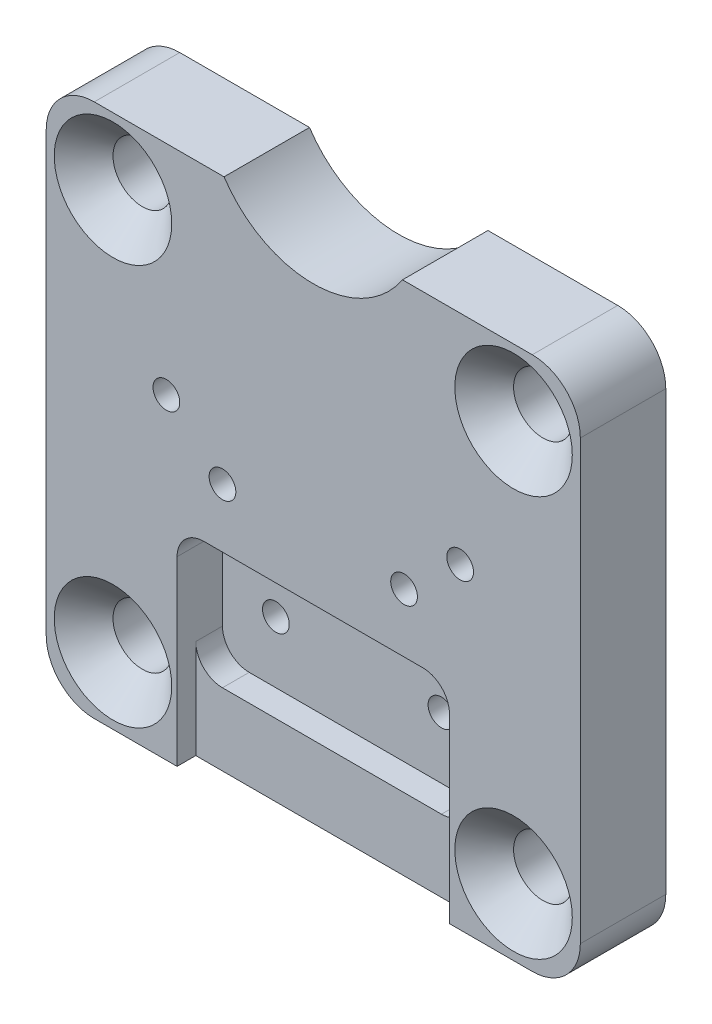
ISO-10303-21;
HEADER;
FILE_DESCRIPTION(('STEP AP214'),'2;1');
FILE_NAME('part.step','',(''),(''),'','','');
FILE_SCHEMA(('AUTOMOTIVE_DESIGN { 1 0 10303 214 1 1 1 1 }'));
ENDSEC;
DATA;
#1=APPLICATION_CONTEXT('core data for automotive mechanical design processes');
#2=APPLICATION_PROTOCOL_DEFINITION('international standard','automotive_design',2000,#1);
#3=PRODUCT_CONTEXT('',#1,'mechanical');
#4=PRODUCT('Part','Part','',(#3));
#5=PRODUCT_RELATED_PRODUCT_CATEGORY('part','',(#4));
#6=PRODUCT_DEFINITION_FORMATION('','',#4);
#7=PRODUCT_DEFINITION_CONTEXT('part definition',#1,'design');
#8=PRODUCT_DEFINITION('design','',#6,#7);
#9=PRODUCT_DEFINITION_SHAPE('','',#8);
#10=(LENGTH_UNIT() NAMED_UNIT(*) SI_UNIT(.MILLI.,.METRE.));
#11=(NAMED_UNIT(*) PLANE_ANGLE_UNIT() SI_UNIT($,.RADIAN.));
#12=(NAMED_UNIT(*) SI_UNIT($,.STERADIAN.) SOLID_ANGLE_UNIT());
#13=UNCERTAINTY_MEASURE_WITH_UNIT(LENGTH_MEASURE(1.E-05),#10,'distance_accuracy_value','');
#14=(GEOMETRIC_REPRESENTATION_CONTEXT(3) GLOBAL_UNCERTAINTY_ASSIGNED_CONTEXT((#13)) GLOBAL_UNIT_ASSIGNED_CONTEXT((#10,
#11,#12)) REPRESENTATION_CONTEXT('',''));
#15=CARTESIAN_POINT('',(0.,0.,0.));
#16=DIRECTION('',(0.,0.,1.));
#17=DIRECTION('',(1.,0.,0.));
#18=AXIS2_PLACEMENT_3D('',#15,#16,#17);
#19=CARTESIAN_POINT('',(10.,10.,3.2));
#20=DIRECTION('',(0.,-1.,0.));
#21=DIRECTION('',(0.,0.,-1.));
#22=AXIS2_PLACEMENT_3D('',#19,#20,#21);
#23=PLANE('',#22);
#24=DIRECTION('',(-1.,0.,0.));
#25=VECTOR('',#24,1.);
#26=CARTESIAN_POINT('',(10.,10.,0.));
#27=LINE('',#26,#25);
#28=CARTESIAN_POINT('',(8.20000000000001,10.,0.));
#29=VERTEX_POINT('',#28);
#30=CARTESIAN_POINT('',(3.34065861769801,10.,0.));
#31=VERTEX_POINT('',#30);
#32=EDGE_CURVE('E192',#29,#31,#27,.T.);
#33=ORIENTED_EDGE('',*,*,#32,.T.);
#34=DIRECTION('',(0.,0.,1.));
#35=VECTOR('',#34,1.);
#36=CARTESIAN_POINT('',(3.34065861769801,10.,0.));
#37=LINE('',#36,#35);
#38=CARTESIAN_POINT('',(3.34065861769801,10.,3.2));
#39=VERTEX_POINT('',#38);
#40=EDGE_CURVE('E51',#31,#39,#37,.T.);
#41=ORIENTED_EDGE('',*,*,#40,.T.);
#42=DIRECTION('',(-1.,0.,0.));
#43=VECTOR('',#42,1.);
#44=CARTESIAN_POINT('',(10.,10.,3.2));
#45=LINE('',#44,#43);
#46=CARTESIAN_POINT('',(8.20000000000001,10.,3.2));
#47=VERTEX_POINT('',#46);
#48=EDGE_CURVE('E205',#47,#39,#45,.T.);
#49=ORIENTED_EDGE('',*,*,#48,.F.);
#50=DIRECTION('',(0.,0.,-1.));
#51=VECTOR('',#50,1.);
#52=CARTESIAN_POINT('',(8.20000000000001,10.,3.2));
#53=LINE('',#52,#51);
#54=EDGE_CURVE('E233',#47,#29,#53,.T.);
#55=ORIENTED_EDGE('',*,*,#54,.T.);
#56=EDGE_LOOP('',(#33,#41,#49,#55));
#57=FACE_BOUND('',#56,.T.);
#58=ADVANCED_FACE('F36',(#57),#23,.F.);
#59=CARTESIAN_POINT('',(-3.1,-5.,3.2));
#60=DIRECTION('',(0.,0.,1.));
#61=DIRECTION('',(1.,0.,0.));
#62=AXIS2_PLACEMENT_3D('',#59,#60,#61);
#63=CYLINDRICAL_SURFACE('',#62,0.499999999999999);
#64=CARTESIAN_POINT('',(-3.1,-5.,0.));
#65=DIRECTION('',(0.,0.,1.));
#66=DIRECTION('',(1.,0.,0.));
#67=AXIS2_PLACEMENT_3D('',#64,#65,#66);
#68=CIRCLE('',#67,0.499999999999999);
#69=CARTESIAN_POINT('',(-2.6,-5.,0.));
#70=VERTEX_POINT('',#69);
#71=EDGE_CURVE('E358',#70,#70,#68,.T.);
#72=ORIENTED_EDGE('',*,*,#71,.F.);
#73=EDGE_LOOP('',(#72));
#74=FACE_BOUND('',#73,.T.);
#75=CARTESIAN_POINT('',(-3.1,-5.,1.5));
#76=DIRECTION('',(0.,0.,1.));
#77=DIRECTION('',(1.,0.,0.));
#78=AXIS2_PLACEMENT_3D('',#75,#76,#77);
#79=CIRCLE('',#78,0.499999999999999);
#80=CARTESIAN_POINT('',(-2.6,-5.,1.5));
#81=VERTEX_POINT('',#80);
#82=EDGE_CURVE('E242',#81,#81,#79,.F.);
#83=ORIENTED_EDGE('',*,*,#82,.F.);
#84=EDGE_LOOP('',(#83));
#85=FACE_BOUND('',#84,.T.);
#86=ADVANCED_FACE('F471',(#74,#85),#63,.F.);
#87=CARTESIAN_POINT('',(3.1,-5.,3.2));
#88=DIRECTION('',(0.,0.,1.));
#89=DIRECTION('',(1.,0.,0.));
#90=AXIS2_PLACEMENT_3D('',#87,#88,#89);
#91=CYLINDRICAL_SURFACE('',#90,0.499999999999999);
#92=CARTESIAN_POINT('',(3.1,-5.,0.));
#93=DIRECTION('',(0.,0.,1.));
#94=DIRECTION('',(1.,0.,0.));
#95=AXIS2_PLACEMENT_3D('',#92,#93,#94);
#96=CIRCLE('',#95,0.499999999999999);
#97=CARTESIAN_POINT('',(3.6,-5.,0.));
#98=VERTEX_POINT('',#97);
#99=EDGE_CURVE('E329',#98,#98,#96,.T.);
#100=ORIENTED_EDGE('',*,*,#99,.F.);
#101=EDGE_LOOP('',(#100));
#102=FACE_BOUND('',#101,.T.);
#103=CARTESIAN_POINT('',(3.1,-5.,1.5));
#104=DIRECTION('',(0.,0.,1.));
#105=DIRECTION('',(1.,0.,0.));
#106=AXIS2_PLACEMENT_3D('',#103,#104,#105);
#107=CIRCLE('',#106,0.499999999999999);
#108=CARTESIAN_POINT('',(3.6,-5.,1.5));
#109=VERTEX_POINT('',#108);
#110=EDGE_CURVE('E239',#109,#109,#107,.F.);
#111=ORIENTED_EDGE('',*,*,#110,.F.);
#112=EDGE_LOOP('',(#111));
#113=FACE_BOUND('',#112,.T.);
#114=ADVANCED_FACE('F476',(#102,#113),#91,.F.);
#115=CARTESIAN_POINT('',(-9.99999999999999,-10.,3.2));
#116=DIRECTION('',(1.,0.,0.));
#117=DIRECTION('',(0.,0.,-1.));
#118=AXIS2_PLACEMENT_3D('',#115,#116,#117);
#119=PLANE('',#118);
#120=DIRECTION('',(0.,-1.,0.));
#121=VECTOR('',#120,1.);
#122=CARTESIAN_POINT('',(-9.99999999999999,-10.,0.));
#123=LINE('',#122,#121);
#124=CARTESIAN_POINT('',(-9.99999999999999,8.2,0.));
#125=VERTEX_POINT('',#124);
#126=CARTESIAN_POINT('',(-9.99999999999999,-8.2,0.));
#127=VERTEX_POINT('',#126);
#128=EDGE_CURVE('E361',#125,#127,#123,.T.);
#129=ORIENTED_EDGE('',*,*,#128,.T.);
#130=DIRECTION('',(0.,0.,-1.));
#131=VECTOR('',#130,1.);
#132=CARTESIAN_POINT('',(-9.99999999999999,-8.2,3.2));
#133=LINE('',#132,#131);
#134=CARTESIAN_POINT('',(-9.99999999999999,-8.2,3.2));
#135=VERTEX_POINT('',#134);
#136=EDGE_CURVE('E218',#127,#135,#133,.F.);
#137=ORIENTED_EDGE('',*,*,#136,.T.);
#138=DIRECTION('',(0.,-1.,0.));
#139=VECTOR('',#138,1.);
#140=CARTESIAN_POINT('',(-9.99999999999999,-10.,3.2));
#141=LINE('',#140,#139);
#142=CARTESIAN_POINT('',(-9.99999999999999,8.2,3.2));
#143=VERTEX_POINT('',#142);
#144=EDGE_CURVE('E195',#143,#135,#141,.T.);
#145=ORIENTED_EDGE('',*,*,#144,.F.);
#146=DIRECTION('',(0.,0.,-1.));
#147=VECTOR('',#146,1.);
#148=CARTESIAN_POINT('',(-9.99999999999999,8.2,3.2));
#149=LINE('',#148,#147);
#150=EDGE_CURVE('E215',#143,#125,#149,.T.);
#151=ORIENTED_EDGE('',*,*,#150,.T.);
#152=EDGE_LOOP('',(#129,#137,#145,#151));
#153=FACE_BOUND('',#152,.T.);
#154=ADVANCED_FACE('F456',(#153),#119,.F.);
#155=CARTESIAN_POINT('',(10.,-9.99999999999999,3.2));
#156=DIRECTION('',(0.,1.,0.));
#157=DIRECTION('',(-1.,0.,0.));
#158=AXIS2_PLACEMENT_3D('',#155,#156,#157);
#159=PLANE('',#158);
#160=DIRECTION('',(1.,0.,0.));
#161=VECTOR('',#160,1.);
#162=CARTESIAN_POINT('',(-5.1,-10.,2.5));
#163=LINE('',#162,#161);
#164=CARTESIAN_POINT('',(-5.1,-10.,2.5));
#165=VERTEX_POINT('',#164);
#166=CARTESIAN_POINT('',(5.1,-10.,2.5));
#167=VERTEX_POINT('',#166);
#168=EDGE_CURVE('E320',#165,#167,#163,.T.);
#169=ORIENTED_EDGE('',*,*,#168,.F.);
#170=DIRECTION('',(0.,0.,1.));
#171=VECTOR('',#170,1.);
#172=CARTESIAN_POINT('',(-5.1,-10.,2.5));
#173=LINE('',#172,#171);
#174=CARTESIAN_POINT('',(-5.1,-10.,3.2));
#175=VERTEX_POINT('',#174);
#176=EDGE_CURVE('E325',#165,#175,#173,.T.);
#177=ORIENTED_EDGE('',*,*,#176,.T.);
#178=DIRECTION('',(1.,0.,0.));
#179=VECTOR('',#178,1.);
#180=CARTESIAN_POINT('',(10.,-9.99999999999999,3.2));
#181=LINE('',#180,#179);
#182=CARTESIAN_POINT('',(-8.2,-10.,3.2));
#183=VERTEX_POINT('',#182);
#184=EDGE_CURVE('E365',#183,#175,#181,.T.);
#185=ORIENTED_EDGE('',*,*,#184,.F.);
#186=DIRECTION('',(0.,0.,-1.));
#187=VECTOR('',#186,1.);
#188=CARTESIAN_POINT('',(-8.2,-10.,3.2));
#189=LINE('',#188,#187);
#190=CARTESIAN_POINT('',(-8.2,-10.,0.));
#191=VERTEX_POINT('',#190);
#192=EDGE_CURVE('E204',#183,#191,#189,.T.);
#193=ORIENTED_EDGE('',*,*,#192,.T.);
#194=DIRECTION('',(1.,0.,0.));
#195=VECTOR('',#194,1.);
#196=CARTESIAN_POINT('',(10.,-9.99999999999999,0.));
#197=LINE('',#196,#195);
#198=CARTESIAN_POINT('',(8.20000000000001,-9.99999999999999,0.));
#199=VERTEX_POINT('',#198);
#200=EDGE_CURVE('E197',#191,#199,#197,.T.);
#201=ORIENTED_EDGE('',*,*,#200,.T.);
#202=DIRECTION('',(0.,0.,-1.));
#203=VECTOR('',#202,1.);
#204=CARTESIAN_POINT('',(8.20000000000001,-9.99999999999999,3.2));
#205=LINE('',#204,#203);
#206=CARTESIAN_POINT('',(8.20000000000001,-9.99999999999999,3.2));
#207=VERTEX_POINT('',#206);
#208=EDGE_CURVE('E201',#199,#207,#205,.F.);
#209=ORIENTED_EDGE('',*,*,#208,.T.);
#210=CARTESIAN_POINT('',(5.1,-10.,3.2));
#211=VERTEX_POINT('',#210);
#212=EDGE_CURVE('E364',#211,#207,#181,.T.);
#213=ORIENTED_EDGE('',*,*,#212,.F.);
#214=DIRECTION('',(0.,0.,1.));
#215=VECTOR('',#214,1.);
#216=CARTESIAN_POINT('',(5.1,-10.,2.5));
#217=LINE('',#216,#215);
#218=EDGE_CURVE('E290',#167,#211,#217,.T.);
#219=ORIENTED_EDGE('',*,*,#218,.F.);
#220=EDGE_LOOP('',(#169,#177,#185,#193,#201,#209,#213,#219));
#221=FACE_BOUND('',#220,.T.);
#222=ADVANCED_FACE('F379',(#221),#159,.F.);
#223=CARTESIAN_POINT('',(10.,-9.99999999999999,3.2));
#224=DIRECTION('',(-1.,0.,0.));
#225=DIRECTION('',(0.,0.,1.));
#226=AXIS2_PLACEMENT_3D('',#223,#224,#225);
#227=PLANE('',#226);
#228=DIRECTION('',(0.,1.,0.));
#229=VECTOR('',#228,1.);
#230=CARTESIAN_POINT('',(10.,-9.99999999999999,3.2));
#231=LINE('',#230,#229);
#232=CARTESIAN_POINT('',(10.,-8.2,3.2));
#233=VERTEX_POINT('',#232);
#234=CARTESIAN_POINT('',(10.,8.2,3.2));
#235=VERTEX_POINT('',#234);
#236=EDGE_CURVE('E368',#233,#235,#231,.T.);
#237=ORIENTED_EDGE('',*,*,#236,.F.);
#238=DIRECTION('',(0.,0.,-1.));
#239=VECTOR('',#238,1.);
#240=CARTESIAN_POINT('',(10.,-8.2,3.2));
#241=LINE('',#240,#239);
#242=CARTESIAN_POINT('',(10.,-8.2,0.));
#243=VERTEX_POINT('',#242);
#244=EDGE_CURVE('E230',#233,#243,#241,.T.);
#245=ORIENTED_EDGE('',*,*,#244,.T.);
#246=DIRECTION('',(0.,1.,0.));
#247=VECTOR('',#246,1.);
#248=CARTESIAN_POINT('',(10.,-9.99999999999999,0.));
#249=LINE('',#248,#247);
#250=CARTESIAN_POINT('',(10.,8.2,0.));
#251=VERTEX_POINT('',#250);
#252=EDGE_CURVE('E193',#243,#251,#249,.T.);
#253=ORIENTED_EDGE('',*,*,#252,.T.);
#254=DIRECTION('',(0.,0.,-1.));
#255=VECTOR('',#254,1.);
#256=CARTESIAN_POINT('',(10.,8.2,3.2));
#257=LINE('',#256,#255);
#258=EDGE_CURVE('E228',#251,#235,#257,.F.);
#259=ORIENTED_EDGE('',*,*,#258,.T.);
#260=EDGE_LOOP('',(#237,#245,#253,#259));
#261=FACE_BOUND('',#260,.T.);
#262=ADVANCED_FACE('F389',(#261),#227,.F.);
#263=CARTESIAN_POINT('',(-3.34065861769801,10.,3.2));
#264=VERTEX_POINT('',#263);
#265=CARTESIAN_POINT('',(-8.2,10.,3.2));
#266=VERTEX_POINT('',#265);
#267=EDGE_CURVE('E186',#264,#266,#45,.T.);
#268=ORIENTED_EDGE('',*,*,#267,.F.);
#269=DIRECTION('',(0.,0.,1.));
#270=VECTOR('',#269,1.);
#271=CARTESIAN_POINT('',(-3.34065861769801,10.,0.));
#272=LINE('',#271,#270);
#273=CARTESIAN_POINT('',(-3.34065861769801,10.,0.));
#274=VERTEX_POINT('',#273);
#275=EDGE_CURVE('E172',#264,#274,#272,.F.);
#276=ORIENTED_EDGE('',*,*,#275,.T.);
#277=CARTESIAN_POINT('',(-8.2,10.,0.));
#278=VERTEX_POINT('',#277);
#279=EDGE_CURVE('E184',#274,#278,#27,.T.);
#280=ORIENTED_EDGE('',*,*,#279,.T.);
#281=DIRECTION('',(0.,0.,-1.));
#282=VECTOR('',#281,1.);
#283=CARTESIAN_POINT('',(-8.2,10.,3.2));
#284=LINE('',#283,#282);
#285=EDGE_CURVE('E236',#278,#266,#284,.F.);
#286=ORIENTED_EDGE('',*,*,#285,.T.);
#287=EDGE_LOOP('',(#268,#276,#280,#286));
#288=FACE_BOUND('',#287,.T.);
#289=ADVANCED_FACE('F182',(#288),#23,.F.);
#290=CARTESIAN_POINT('',(-9.99999999999999,10.,3.2));
#291=DIRECTION('',(0.,0.,1.));
#292=DIRECTION('',(1.,0.,0.));
#293=AXIS2_PLACEMENT_3D('',#290,#291,#292);
#294=PLANE('',#293);
#295=CARTESIAN_POINT('',(0.,12.2,3.2));
#296=DIRECTION('',(0.,0.,1.));
#297=DIRECTION('',(1.,0.,0.));
#298=AXIS2_PLACEMENT_3D('',#295,#296,#297);
#299=CIRCLE('',#298,4.);
#300=EDGE_CURVE('E178',#264,#39,#299,.T.);
#301=ORIENTED_EDGE('',*,*,#300,.F.);
#302=ORIENTED_EDGE('',*,*,#267,.T.);
#303=CARTESIAN_POINT('',(-8.2,8.2,3.2));
#304=DIRECTION('',(0.,0.,1.));
#305=DIRECTION('',(1.,0.,0.));
#306=AXIS2_PLACEMENT_3D('',#303,#304,#305);
#307=CIRCLE('',#306,1.8);
#308=EDGE_CURVE('E222',#266,#143,#307,.T.);
#309=ORIENTED_EDGE('',*,*,#308,.T.);
#310=ORIENTED_EDGE('',*,*,#144,.T.);
#311=CARTESIAN_POINT('',(-8.2,-8.2,3.2));
#312=DIRECTION('',(0.,0.,1.));
#313=DIRECTION('',(1.,0.,0.));
#314=AXIS2_PLACEMENT_3D('',#311,#312,#313);
#315=CIRCLE('',#314,1.8);
#316=EDGE_CURVE('E226',#135,#183,#315,.T.);
#317=ORIENTED_EDGE('',*,*,#316,.T.);
#318=ORIENTED_EDGE('',*,*,#184,.T.);
#319=DIRECTION('',(0.,-1.,0.));
#320=VECTOR('',#319,1.);
#321=CARTESIAN_POINT('',(-5.1,-10.,3.2));
#322=LINE('',#321,#320);
#323=CARTESIAN_POINT('',(-5.1,-3.2,3.2));
#324=VERTEX_POINT('',#323);
#325=EDGE_CURVE('E291',#324,#175,#322,.T.);
#326=ORIENTED_EDGE('',*,*,#325,.F.);
#327=CARTESIAN_POINT('',(-4.1,-3.2,3.2));
#328=DIRECTION('',(0.,0.,1.));
#329=DIRECTION('',(1.,0.,0.));
#330=AXIS2_PLACEMENT_3D('',#327,#328,#329);
#331=CIRCLE('',#330,1.);
#332=CARTESIAN_POINT('',(-4.1,-2.2,3.2));
#333=VERTEX_POINT('',#332);
#334=EDGE_CURVE('E11',#324,#333,#331,.F.);
#335=ORIENTED_EDGE('',*,*,#334,.T.);
#336=DIRECTION('',(-1.,0.,0.));
#337=VECTOR('',#336,1.);
#338=CARTESIAN_POINT('',(-5.1,-2.2,3.2));
#339=LINE('',#338,#337);
#340=CARTESIAN_POINT('',(4.1,-2.2,3.2));
#341=VERTEX_POINT('',#340);
#342=EDGE_CURVE('E281',#341,#333,#339,.T.);
#343=ORIENTED_EDGE('',*,*,#342,.F.);
#344=CARTESIAN_POINT('',(4.1,-3.2,3.2));
#345=DIRECTION('',(0.,0.,1.));
#346=DIRECTION('',(1.,0.,0.));
#347=AXIS2_PLACEMENT_3D('',#344,#345,#346);
#348=CIRCLE('',#347,1.);
#349=CARTESIAN_POINT('',(5.1,-3.2,3.2));
#350=VERTEX_POINT('',#349);
#351=EDGE_CURVE('E44',#341,#350,#348,.F.);
#352=ORIENTED_EDGE('',*,*,#351,.T.);
#353=DIRECTION('',(0.,1.,0.));
#354=VECTOR('',#353,1.);
#355=CARTESIAN_POINT('',(5.1,-10.,3.2));
#356=LINE('',#355,#354);
#357=EDGE_CURVE('E279',#211,#350,#356,.T.);
#358=ORIENTED_EDGE('',*,*,#357,.F.);
#359=ORIENTED_EDGE('',*,*,#212,.T.);
#360=CARTESIAN_POINT('',(8.20000000000001,-8.2,3.2));
#361=DIRECTION('',(0.,0.,1.));
#362=DIRECTION('',(1.,0.,0.));
#363=AXIS2_PLACEMENT_3D('',#360,#361,#362);
#364=CIRCLE('',#363,1.8);
#365=EDGE_CURVE('E224',#207,#233,#364,.T.);
#366=ORIENTED_EDGE('',*,*,#365,.T.);
#367=ORIENTED_EDGE('',*,*,#236,.T.);
#368=CARTESIAN_POINT('',(8.20000000000001,8.2,3.2));
#369=DIRECTION('',(0.,0.,1.));
#370=DIRECTION('',(1.,0.,0.));
#371=AXIS2_PLACEMENT_3D('',#368,#369,#370);
#372=CIRCLE('',#371,1.8);
#373=EDGE_CURVE('E220',#235,#47,#372,.T.);
#374=ORIENTED_EDGE('',*,*,#373,.T.);
#375=ORIENTED_EDGE('',*,*,#48,.T.);
#376=EDGE_LOOP('',(#301,#302,#309,#310,#317,#318,#326,#335,#343,#352,#358,#359,#366,#367,#374,#375));
#377=FACE_BOUND('',#376,.T.);
#378=CARTESIAN_POINT('',(-7.5,7.5,3.2));
#379=DIRECTION('',(0.,0.,1.));
#380=DIRECTION('',(1.,0.,0.));
#381=AXIS2_PLACEMENT_3D('',#378,#379,#380);
#382=CIRCLE('',#381,2.2);
#383=CARTESIAN_POINT('',(-5.3,7.5,3.2));
#384=VERTEX_POINT('',#383);
#385=EDGE_CURVE('E397',#384,#384,#382,.T.);
#386=ORIENTED_EDGE('',*,*,#385,.F.);
#387=EDGE_LOOP('',(#386));
#388=FACE_BOUND('',#387,.T.);
#389=CARTESIAN_POINT('',(-7.5,-7.5,3.2));
#390=DIRECTION('',(0.,0.,1.));
#391=DIRECTION('',(1.,0.,0.));
#392=AXIS2_PLACEMENT_3D('',#389,#390,#391);
#393=CIRCLE('',#392,2.2);
#394=CARTESIAN_POINT('',(-5.3,-7.5,3.2));
#395=VERTEX_POINT('',#394);
#396=EDGE_CURVE('E409',#395,#395,#393,.T.);
#397=ORIENTED_EDGE('',*,*,#396,.F.);
#398=EDGE_LOOP('',(#397));
#399=FACE_BOUND('',#398,.T.);
#400=CARTESIAN_POINT('',(7.5,-7.5,3.2));
#401=DIRECTION('',(0.,0.,1.));
#402=DIRECTION('',(1.,0.,0.));
#403=AXIS2_PLACEMENT_3D('',#400,#401,#402);
#404=CIRCLE('',#403,2.2);
#405=CARTESIAN_POINT('',(9.7,-7.5,3.2));
#406=VERTEX_POINT('',#405);
#407=EDGE_CURVE('E418',#406,#406,#404,.T.);
#408=ORIENTED_EDGE('',*,*,#407,.F.);
#409=EDGE_LOOP('',(#408));
#410=FACE_BOUND('',#409,.T.);
#411=CARTESIAN_POINT('',(7.5,7.5,3.2));
#412=DIRECTION('',(0.,0.,1.));
#413=DIRECTION('',(1.,0.,0.));
#414=AXIS2_PLACEMENT_3D('',#411,#412,#413);
#415=CIRCLE('',#414,2.2);
#416=CARTESIAN_POINT('',(9.7,7.5,3.2));
#417=VERTEX_POINT('',#416);
#418=EDGE_CURVE('E427',#417,#417,#415,.T.);
#419=ORIENTED_EDGE('',*,*,#418,.F.);
#420=EDGE_LOOP('',(#419));
#421=FACE_BOUND('',#420,.T.);
#422=CARTESIAN_POINT('',(3.4,0.,3.2));
#423=DIRECTION('',(0.,0.,1.));
#424=DIRECTION('',(1.,0.,0.));
#425=AXIS2_PLACEMENT_3D('',#422,#423,#424);
#426=CIRCLE('',#425,0.499999999999999);
#427=CARTESIAN_POINT('',(3.9,0.,3.2));
#428=VERTEX_POINT('',#427);
#429=EDGE_CURVE('E334',#428,#428,#426,.T.);
#430=ORIENTED_EDGE('',*,*,#429,.F.);
#431=EDGE_LOOP('',(#430));
#432=FACE_BOUND('',#431,.T.);
#433=CARTESIAN_POINT('',(5.5,1.85,3.2));
#434=DIRECTION('',(0.,0.,1.));
#435=DIRECTION('',(1.,0.,0.));
#436=AXIS2_PLACEMENT_3D('',#433,#434,#435);
#437=CIRCLE('',#436,0.5);
#438=CARTESIAN_POINT('',(6.,1.85,3.2));
#439=VERTEX_POINT('',#438);
#440=EDGE_CURVE('E340',#439,#439,#437,.T.);
#441=ORIENTED_EDGE('',*,*,#440,.F.);
#442=EDGE_LOOP('',(#441));
#443=FACE_BOUND('',#442,.T.);
#444=CARTESIAN_POINT('',(-5.5,1.85,3.2));
#445=DIRECTION('',(0.,0.,1.));
#446=DIRECTION('',(1.,0.,0.));
#447=AXIS2_PLACEMENT_3D('',#444,#445,#446);
#448=CIRCLE('',#447,0.5);
#449=CARTESIAN_POINT('',(-5.,1.85,3.2));
#450=VERTEX_POINT('',#449);
#451=EDGE_CURVE('E346',#450,#450,#448,.T.);
#452=ORIENTED_EDGE('',*,*,#451,.F.);
#453=EDGE_LOOP('',(#452));
#454=FACE_BOUND('',#453,.T.);
#455=CARTESIAN_POINT('',(-3.4,0.,3.2));
#456=DIRECTION('',(0.,0.,1.));
#457=DIRECTION('',(1.,0.,0.));
#458=AXIS2_PLACEMENT_3D('',#455,#456,#457);
#459=CIRCLE('',#458,0.499999999999999);
#460=CARTESIAN_POINT('',(-2.9,0.,3.2));
#461=VERTEX_POINT('',#460);
#462=EDGE_CURVE('E352',#461,#461,#459,.T.);
#463=ORIENTED_EDGE('',*,*,#462,.F.);
#464=EDGE_LOOP('',(#463));
#465=FACE_BOUND('',#464,.T.);
#466=ADVANCED_FACE('F277',(#377,#388,#399,#410,#421,#432,#443,#454,#465),#294,.T.);
#467=CARTESIAN_POINT('',(-9.99999999999999,10.,0.));
#468=DIRECTION('',(0.,0.,1.));
#469=DIRECTION('',(1.,0.,0.));
#470=AXIS2_PLACEMENT_3D('',#467,#468,#469);
#471=PLANE('',#470);
#472=CARTESIAN_POINT('',(-7.5,7.5,0.));
#473=DIRECTION('',(0.,0.,1.));
#474=DIRECTION('',(1.,0.,0.));
#475=AXIS2_PLACEMENT_3D('',#472,#473,#474);
#476=CIRCLE('',#475,1.1);
#477=CARTESIAN_POINT('',(-6.4,7.5,0.));
#478=VERTEX_POINT('',#477);
#479=EDGE_CURVE('E406',#478,#478,#476,.T.);
#480=ORIENTED_EDGE('',*,*,#479,.T.);
#481=EDGE_LOOP('',(#480));
#482=FACE_BOUND('',#481,.T.);
#483=CARTESIAN_POINT('',(-7.5,-7.5,0.));
#484=DIRECTION('',(0.,0.,1.));
#485=DIRECTION('',(1.,0.,0.));
#486=AXIS2_PLACEMENT_3D('',#483,#484,#485);
#487=CIRCLE('',#486,1.1);
#488=CARTESIAN_POINT('',(-6.4,-7.5,0.));
#489=VERTEX_POINT('',#488);
#490=EDGE_CURVE('E415',#489,#489,#487,.T.);
#491=ORIENTED_EDGE('',*,*,#490,.T.);
#492=EDGE_LOOP('',(#491));
#493=FACE_BOUND('',#492,.T.);
#494=CARTESIAN_POINT('',(7.5,-7.5,0.));
#495=DIRECTION('',(0.,0.,1.));
#496=DIRECTION('',(1.,0.,0.));
#497=AXIS2_PLACEMENT_3D('',#494,#495,#496);
#498=CIRCLE('',#497,1.1);
#499=CARTESIAN_POINT('',(8.6,-7.5,0.));
#500=VERTEX_POINT('',#499);
#501=EDGE_CURVE('E424',#500,#500,#498,.T.);
#502=ORIENTED_EDGE('',*,*,#501,.T.);
#503=EDGE_LOOP('',(#502));
#504=FACE_BOUND('',#503,.T.);
#505=CARTESIAN_POINT('',(7.5,7.5,0.));
#506=DIRECTION('',(0.,0.,1.));
#507=DIRECTION('',(1.,0.,0.));
#508=AXIS2_PLACEMENT_3D('',#505,#506,#507);
#509=CIRCLE('',#508,1.1);
#510=CARTESIAN_POINT('',(8.6,7.5,0.));
#511=VERTEX_POINT('',#510);
#512=EDGE_CURVE('E315',#511,#511,#509,.T.);
#513=ORIENTED_EDGE('',*,*,#512,.T.);
#514=EDGE_LOOP('',(#513));
#515=FACE_BOUND('',#514,.T.);
#516=ORIENTED_EDGE('',*,*,#99,.T.);
#517=EDGE_LOOP('',(#516));
#518=FACE_BOUND('',#517,.T.);
#519=CARTESIAN_POINT('',(3.4,0.,0.));
#520=DIRECTION('',(0.,0.,1.));
#521=DIRECTION('',(1.,0.,0.));
#522=AXIS2_PLACEMENT_3D('',#519,#520,#521);
#523=CIRCLE('',#522,0.499999999999999);
#524=CARTESIAN_POINT('',(3.9,0.,0.));
#525=VERTEX_POINT('',#524);
#526=EDGE_CURVE('E337',#525,#525,#523,.T.);
#527=ORIENTED_EDGE('',*,*,#526,.T.);
#528=EDGE_LOOP('',(#527));
#529=FACE_BOUND('',#528,.T.);
#530=CARTESIAN_POINT('',(5.5,1.85,0.));
#531=DIRECTION('',(0.,0.,1.));
#532=DIRECTION('',(1.,0.,0.));
#533=AXIS2_PLACEMENT_3D('',#530,#531,#532);
#534=CIRCLE('',#533,0.499999999999999);
#535=CARTESIAN_POINT('',(6.,1.85,0.));
#536=VERTEX_POINT('',#535);
#537=EDGE_CURVE('E343',#536,#536,#534,.T.);
#538=ORIENTED_EDGE('',*,*,#537,.T.);
#539=EDGE_LOOP('',(#538));
#540=FACE_BOUND('',#539,.T.);
#541=CARTESIAN_POINT('',(-5.5,1.85,0.));
#542=DIRECTION('',(0.,0.,1.));
#543=DIRECTION('',(1.,0.,0.));
#544=AXIS2_PLACEMENT_3D('',#541,#542,#543);
#545=CIRCLE('',#544,0.499999999999999);
#546=CARTESIAN_POINT('',(-5.,1.85,0.));
#547=VERTEX_POINT('',#546);
#548=EDGE_CURVE('E349',#547,#547,#545,.T.);
#549=ORIENTED_EDGE('',*,*,#548,.T.);
#550=EDGE_LOOP('',(#549));
#551=FACE_BOUND('',#550,.T.);
#552=CARTESIAN_POINT('',(-3.4,0.,0.));
#553=DIRECTION('',(0.,0.,1.));
#554=DIRECTION('',(1.,0.,0.));
#555=AXIS2_PLACEMENT_3D('',#552,#553,#554);
#556=CIRCLE('',#555,0.499999999999999);
#557=CARTESIAN_POINT('',(-2.9,0.,0.));
#558=VERTEX_POINT('',#557);
#559=EDGE_CURVE('E355',#558,#558,#556,.T.);
#560=ORIENTED_EDGE('',*,*,#559,.T.);
#561=EDGE_LOOP('',(#560));
#562=FACE_BOUND('',#561,.T.);
#563=ORIENTED_EDGE('',*,*,#71,.T.);
#564=EDGE_LOOP('',(#563));
#565=FACE_BOUND('',#564,.T.);
#566=ORIENTED_EDGE('',*,*,#279,.F.);
#567=CARTESIAN_POINT('',(0.,12.2,0.));
#568=DIRECTION('',(0.,0.,1.));
#569=DIRECTION('',(1.,0.,0.));
#570=AXIS2_PLACEMENT_3D('',#567,#568,#569);
#571=CIRCLE('',#570,4.);
#572=EDGE_CURVE('E169',#274,#31,#571,.T.);
#573=ORIENTED_EDGE('',*,*,#572,.T.);
#574=ORIENTED_EDGE('',*,*,#32,.F.);
#575=CARTESIAN_POINT('',(8.20000000000001,8.2,0.));
#576=DIRECTION('',(0.,0.,1.));
#577=DIRECTION('',(1.,0.,0.));
#578=AXIS2_PLACEMENT_3D('',#575,#576,#577);
#579=CIRCLE('',#578,1.8);
#580=EDGE_CURVE('E208',#29,#251,#579,.F.);
#581=ORIENTED_EDGE('',*,*,#580,.T.);
#582=ORIENTED_EDGE('',*,*,#252,.F.);
#583=CARTESIAN_POINT('',(8.20000000000001,-8.2,0.));
#584=DIRECTION('',(0.,0.,1.));
#585=DIRECTION('',(1.,0.,0.));
#586=AXIS2_PLACEMENT_3D('',#583,#584,#585);
#587=CIRCLE('',#586,1.8);
#588=EDGE_CURVE('E211',#243,#199,#587,.F.);
#589=ORIENTED_EDGE('',*,*,#588,.T.);
#590=ORIENTED_EDGE('',*,*,#200,.F.);
#591=CARTESIAN_POINT('',(-8.2,-8.2,0.));
#592=DIRECTION('',(0.,0.,1.));
#593=DIRECTION('',(1.,0.,0.));
#594=AXIS2_PLACEMENT_3D('',#591,#592,#593);
#595=CIRCLE('',#594,1.8);
#596=EDGE_CURVE('E213',#191,#127,#595,.F.);
#597=ORIENTED_EDGE('',*,*,#596,.T.);
#598=ORIENTED_EDGE('',*,*,#128,.F.);
#599=CARTESIAN_POINT('',(-8.2,8.2,0.));
#600=DIRECTION('',(0.,0.,1.));
#601=DIRECTION('',(1.,0.,0.));
#602=AXIS2_PLACEMENT_3D('',#599,#600,#601);
#603=CIRCLE('',#602,1.8);
#604=EDGE_CURVE('E190',#125,#278,#603,.F.);
#605=ORIENTED_EDGE('',*,*,#604,.T.);
#606=EDGE_LOOP('',(#566,#573,#574,#581,#582,#589,#590,#597,#598,#605));
#607=FACE_BOUND('',#606,.T.);
#608=ADVANCED_FACE('F188',(#482,#493,#504,#515,#518,#529,#540,#551,#562,#565,#607),#471,.F.);
#609=CARTESIAN_POINT('',(-8.2,-8.2,3.2));
#610=DIRECTION('',(0.,0.,-1.));
#611=DIRECTION('',(-1.,0.,0.));
#612=AXIS2_PLACEMENT_3D('',#609,#610,#611);
#613=CYLINDRICAL_SURFACE('',#612,1.8);
#614=ORIENTED_EDGE('',*,*,#316,.F.);
#615=ORIENTED_EDGE('',*,*,#136,.F.);
#616=ORIENTED_EDGE('',*,*,#596,.F.);
#617=ORIENTED_EDGE('',*,*,#192,.F.);
#618=EDGE_LOOP('',(#614,#615,#616,#617));
#619=FACE_BOUND('',#618,.T.);
#620=ADVANCED_FACE('F454',(#619),#613,.T.);
#621=CARTESIAN_POINT('',(8.20000000000001,-8.2,3.2));
#622=DIRECTION('',(0.,0.,-1.));
#623=DIRECTION('',(-1.,0.,0.));
#624=AXIS2_PLACEMENT_3D('',#621,#622,#623);
#625=CYLINDRICAL_SURFACE('',#624,1.8);
#626=ORIENTED_EDGE('',*,*,#365,.F.);
#627=ORIENTED_EDGE('',*,*,#208,.F.);
#628=ORIENTED_EDGE('',*,*,#588,.F.);
#629=ORIENTED_EDGE('',*,*,#244,.F.);
#630=EDGE_LOOP('',(#626,#627,#628,#629));
#631=FACE_BOUND('',#630,.T.);
#632=ADVANCED_FACE('F384',(#631),#625,.T.);
#633=CARTESIAN_POINT('',(-8.2,8.2,3.2));
#634=DIRECTION('',(0.,0.,-1.));
#635=DIRECTION('',(-1.,0.,0.));
#636=AXIS2_PLACEMENT_3D('',#633,#634,#635);
#637=CYLINDRICAL_SURFACE('',#636,1.8);
#638=ORIENTED_EDGE('',*,*,#308,.F.);
#639=ORIENTED_EDGE('',*,*,#285,.F.);
#640=ORIENTED_EDGE('',*,*,#604,.F.);
#641=ORIENTED_EDGE('',*,*,#150,.F.);
#642=EDGE_LOOP('',(#638,#639,#640,#641));
#643=FACE_BOUND('',#642,.T.);
#644=ADVANCED_FACE('F460',(#643),#637,.T.);
#645=CARTESIAN_POINT('',(8.20000000000001,8.2,3.2));
#646=DIRECTION('',(0.,0.,-1.));
#647=DIRECTION('',(-1.,0.,0.));
#648=AXIS2_PLACEMENT_3D('',#645,#646,#647);
#649=CYLINDRICAL_SURFACE('',#648,1.8);
#650=ORIENTED_EDGE('',*,*,#373,.F.);
#651=ORIENTED_EDGE('',*,*,#258,.F.);
#652=ORIENTED_EDGE('',*,*,#580,.F.);
#653=ORIENTED_EDGE('',*,*,#54,.F.);
#654=EDGE_LOOP('',(#650,#651,#652,#653));
#655=FACE_BOUND('',#654,.T.);
#656=ADVANCED_FACE('F393',(#655),#649,.T.);
#657=CARTESIAN_POINT('',(-3.4,0.,3.2));
#658=DIRECTION('',(0.,0.,1.));
#659=DIRECTION('',(1.,0.,0.));
#660=AXIS2_PLACEMENT_3D('',#657,#658,#659);
#661=CYLINDRICAL_SURFACE('',#660,0.499999999999999);
#662=ORIENTED_EDGE('',*,*,#559,.F.);
#663=EDGE_LOOP('',(#662));
#664=FACE_BOUND('',#663,.T.);
#665=ORIENTED_EDGE('',*,*,#462,.T.);
#666=EDGE_LOOP('',(#665));
#667=FACE_BOUND('',#666,.T.);
#668=ADVANCED_FACE('F467',(#664,#667),#661,.F.);
#669=CARTESIAN_POINT('',(-5.5,1.85,3.2));
#670=DIRECTION('',(0.,0.,1.));
#671=DIRECTION('',(1.,0.,0.));
#672=AXIS2_PLACEMENT_3D('',#669,#670,#671);
#673=CYLINDRICAL_SURFACE('',#672,0.499999999999999);
#674=ORIENTED_EDGE('',*,*,#548,.F.);
#675=EDGE_LOOP('',(#674));
#676=FACE_BOUND('',#675,.T.);
#677=ORIENTED_EDGE('',*,*,#451,.T.);
#678=EDGE_LOOP('',(#677));
#679=FACE_BOUND('',#678,.T.);
#680=ADVANCED_FACE('F505',(#676,#679),#673,.F.);
#681=CARTESIAN_POINT('',(5.5,1.85,3.2));
#682=DIRECTION('',(0.,0.,1.));
#683=DIRECTION('',(1.,0.,0.));
#684=AXIS2_PLACEMENT_3D('',#681,#682,#683);
#685=CYLINDRICAL_SURFACE('',#684,0.499999999999999);
#686=ORIENTED_EDGE('',*,*,#537,.F.);
#687=EDGE_LOOP('',(#686));
#688=FACE_BOUND('',#687,.T.);
#689=ORIENTED_EDGE('',*,*,#440,.T.);
#690=EDGE_LOOP('',(#689));
#691=FACE_BOUND('',#690,.T.);
#692=ADVANCED_FACE('F509',(#688,#691),#685,.F.);
#693=CARTESIAN_POINT('',(3.4,0.,3.2));
#694=DIRECTION('',(0.,0.,1.));
#695=DIRECTION('',(1.,0.,0.));
#696=AXIS2_PLACEMENT_3D('',#693,#694,#695);
#697=CYLINDRICAL_SURFACE('',#696,0.499999999999999);
#698=ORIENTED_EDGE('',*,*,#526,.F.);
#699=EDGE_LOOP('',(#698));
#700=FACE_BOUND('',#699,.T.);
#701=ORIENTED_EDGE('',*,*,#429,.T.);
#702=EDGE_LOOP('',(#701));
#703=FACE_BOUND('',#702,.T.);
#704=ADVANCED_FACE('F513',(#700,#703),#697,.F.);
#705=CARTESIAN_POINT('',(-5.1,-2.2,2.5));
#706=DIRECTION('',(0.,0.,-1.));
#707=DIRECTION('',(-1.,0.,0.));
#708=AXIS2_PLACEMENT_3D('',#705,#706,#707);
#709=PLANE('',#708);
#710=DIRECTION('',(0.,1.,0.));
#711=VECTOR('',#710,1.);
#712=CARTESIAN_POINT('',(5.1,-10.,2.5));
#713=LINE('',#712,#711);
#714=CARTESIAN_POINT('',(5.1,-6.3,2.5));
#715=VERTEX_POINT('',#714);
#716=EDGE_CURVE('E323',#167,#715,#713,.T.);
#717=ORIENTED_EDGE('',*,*,#716,.T.);
#718=CARTESIAN_POINT('',(4.1,-6.3,2.5));
#719=DIRECTION('',(0.,0.,-1.));
#720=DIRECTION('',(-1.,0.,0.));
#721=AXIS2_PLACEMENT_3D('',#718,#719,#720);
#722=CIRCLE('',#721,1.);
#723=CARTESIAN_POINT('',(4.1,-7.3,2.5));
#724=VERTEX_POINT('',#723);
#725=EDGE_CURVE('E271',#715,#724,#722,.T.);
#726=ORIENTED_EDGE('',*,*,#725,.T.);
#727=DIRECTION('',(1.,0.,0.));
#728=VECTOR('',#727,1.);
#729=CARTESIAN_POINT('',(-5.1,-7.3,2.5));
#730=LINE('',#729,#728);
#731=CARTESIAN_POINT('',(-4.1,-7.3,2.5));
#732=VERTEX_POINT('',#731);
#733=EDGE_CURVE('E311',#732,#724,#730,.T.);
#734=ORIENTED_EDGE('',*,*,#733,.F.);
#735=CARTESIAN_POINT('',(-4.1,-6.3,2.5));
#736=DIRECTION('',(0.,0.,-1.));
#737=DIRECTION('',(-1.,0.,0.));
#738=AXIS2_PLACEMENT_3D('',#735,#736,#737);
#739=CIRCLE('',#738,1.);
#740=CARTESIAN_POINT('',(-5.1,-6.3,2.5));
#741=VERTEX_POINT('',#740);
#742=EDGE_CURVE('E273',#732,#741,#739,.T.);
#743=ORIENTED_EDGE('',*,*,#742,.T.);
#744=DIRECTION('',(0.,-1.,0.));
#745=VECTOR('',#744,1.);
#746=CARTESIAN_POINT('',(-5.1,-10.,2.5));
#747=LINE('',#746,#745);
#748=EDGE_CURVE('E318',#741,#165,#747,.T.);
#749=ORIENTED_EDGE('',*,*,#748,.T.);
#750=ORIENTED_EDGE('',*,*,#168,.T.);
#751=EDGE_LOOP('',(#717,#726,#734,#743,#749,#750));
#752=FACE_BOUND('',#751,.T.);
#753=ADVANCED_FACE('F447',(#752),#709,.F.);
#754=CARTESIAN_POINT('',(-5.1,-10.,2.5));
#755=DIRECTION('',(-1.,0.,0.));
#756=DIRECTION('',(0.,0.,1.));
#757=AXIS2_PLACEMENT_3D('',#754,#755,#756);
#758=PLANE('',#757);
#759=ORIENTED_EDGE('',*,*,#748,.F.);
#760=DIRECTION('',(0.,0.,1.));
#761=VECTOR('',#760,1.);
#762=CARTESIAN_POINT('',(-5.1,-6.3,1.5));
#763=LINE('',#762,#761);
#764=CARTESIAN_POINT('',(-5.1,-6.3,1.5));
#765=VERTEX_POINT('',#764);
#766=EDGE_CURVE('E264',#741,#765,#763,.F.);
#767=ORIENTED_EDGE('',*,*,#766,.T.);
#768=DIRECTION('',(0.,-1.,0.));
#769=VECTOR('',#768,1.);
#770=CARTESIAN_POINT('',(-5.1,-2.2,1.5));
#771=LINE('',#770,#769);
#772=CARTESIAN_POINT('',(-5.1,-3.2,1.5));
#773=VERTEX_POINT('',#772);
#774=EDGE_CURVE('E314',#773,#765,#771,.T.);
#775=ORIENTED_EDGE('',*,*,#774,.F.);
#776=DIRECTION('',(0.,0.,1.));
#777=VECTOR('',#776,1.);
#778=CARTESIAN_POINT('',(-5.1,-3.2,3.2));
#779=LINE('',#778,#777);
#780=EDGE_CURVE('E261',#773,#324,#779,.T.);
#781=ORIENTED_EDGE('',*,*,#780,.T.);
#782=ORIENTED_EDGE('',*,*,#325,.T.);
#783=ORIENTED_EDGE('',*,*,#176,.F.);
#784=EDGE_LOOP('',(#759,#767,#775,#781,#782,#783));
#785=FACE_BOUND('',#784,.T.);
#786=ADVANCED_FACE('F521',(#785),#758,.F.);
#787=CARTESIAN_POINT('',(-5.1,-2.2,2.5));
#788=DIRECTION('',(0.,1.,0.));
#789=DIRECTION('',(-1.,0.,0.));
#790=AXIS2_PLACEMENT_3D('',#787,#788,#789);
#791=PLANE('',#790);
#792=DIRECTION('',(-1.,0.,0.));
#793=VECTOR('',#792,1.);
#794=CARTESIAN_POINT('',(-5.1,-2.2,1.5));
#795=LINE('',#794,#793);
#796=CARTESIAN_POINT('',(4.1,-2.2,1.5));
#797=VERTEX_POINT('',#796);
#798=CARTESIAN_POINT('',(-4.1,-2.2,1.5));
#799=VERTEX_POINT('',#798);
#800=EDGE_CURVE('E243',#797,#799,#795,.T.);
#801=ORIENTED_EDGE('',*,*,#800,.F.);
#802=DIRECTION('',(0.,0.,1.));
#803=VECTOR('',#802,1.);
#804=CARTESIAN_POINT('',(4.1,-2.2,3.2));
#805=LINE('',#804,#803);
#806=EDGE_CURVE('E268',#797,#341,#805,.T.);
#807=ORIENTED_EDGE('',*,*,#806,.T.);
#808=ORIENTED_EDGE('',*,*,#342,.T.);
#809=DIRECTION('',(0.,0.,1.));
#810=VECTOR('',#809,1.);
#811=CARTESIAN_POINT('',(-4.1,-2.2,1.5));
#812=LINE('',#811,#810);
#813=EDGE_CURVE('E266',#333,#799,#812,.F.);
#814=ORIENTED_EDGE('',*,*,#813,.T.);
#815=EDGE_LOOP('',(#801,#807,#808,#814));
#816=FACE_BOUND('',#815,.T.);
#817=ADVANCED_FACE('F304',(#816),#791,.F.);
#818=CARTESIAN_POINT('',(5.1,-10.,2.5));
#819=DIRECTION('',(1.,0.,0.));
#820=DIRECTION('',(0.,1.,0.));
#821=AXIS2_PLACEMENT_3D('',#818,#819,#820);
#822=PLANE('',#821);
#823=DIRECTION('',(0.,1.,0.));
#824=VECTOR('',#823,1.);
#825=CARTESIAN_POINT('',(5.1,-2.2,1.5));
#826=LINE('',#825,#824);
#827=CARTESIAN_POINT('',(5.1,-6.3,1.5));
#828=VERTEX_POINT('',#827);
#829=CARTESIAN_POINT('',(5.1,-3.2,1.5));
#830=VERTEX_POINT('',#829);
#831=EDGE_CURVE('E302',#828,#830,#826,.T.);
#832=ORIENTED_EDGE('',*,*,#831,.F.);
#833=DIRECTION('',(0.,0.,1.));
#834=VECTOR('',#833,1.);
#835=CARTESIAN_POINT('',(5.1,-6.3,2.5));
#836=LINE('',#835,#834);
#837=EDGE_CURVE('E245',#828,#715,#836,.T.);
#838=ORIENTED_EDGE('',*,*,#837,.T.);
#839=ORIENTED_EDGE('',*,*,#716,.F.);
#840=ORIENTED_EDGE('',*,*,#218,.T.);
#841=ORIENTED_EDGE('',*,*,#357,.T.);
#842=DIRECTION('',(0.,0.,1.));
#843=VECTOR('',#842,1.);
#844=CARTESIAN_POINT('',(5.1,-3.2,1.5));
#845=LINE('',#844,#843);
#846=EDGE_CURVE('E238',#350,#830,#845,.F.);
#847=ORIENTED_EDGE('',*,*,#846,.T.);
#848=EDGE_LOOP('',(#832,#838,#839,#840,#841,#847));
#849=FACE_BOUND('',#848,.T.);
#850=ADVANCED_FACE('F287',(#849),#822,.F.);
#851=CARTESIAN_POINT('',(-5.1,-7.3,1.5));
#852=DIRECTION('',(0.,0.,1.));
#853=DIRECTION('',(1.,0.,0.));
#854=AXIS2_PLACEMENT_3D('',#851,#852,#853);
#855=PLANE('',#854);
#856=ORIENTED_EDGE('',*,*,#110,.T.);
#857=EDGE_LOOP('',(#856));
#858=FACE_BOUND('',#857,.T.);
#859=DIRECTION('',(1.,0.,0.));
#860=VECTOR('',#859,1.);
#861=CARTESIAN_POINT('',(-5.1,-7.3,1.5));
#862=LINE('',#861,#860);
#863=CARTESIAN_POINT('',(-4.1,-7.3,1.5));
#864=VERTEX_POINT('',#863);
#865=CARTESIAN_POINT('',(4.1,-7.3,1.5));
#866=VERTEX_POINT('',#865);
#867=EDGE_CURVE('E307',#864,#866,#862,.T.);
#868=ORIENTED_EDGE('',*,*,#867,.T.);
#869=CARTESIAN_POINT('',(4.1,-6.3,1.5));
#870=DIRECTION('',(0.,0.,1.));
#871=DIRECTION('',(1.,0.,0.));
#872=AXIS2_PLACEMENT_3D('',#869,#870,#871);
#873=CIRCLE('',#872,1.);
#874=EDGE_CURVE('E259',#866,#828,#873,.T.);
#875=ORIENTED_EDGE('',*,*,#874,.T.);
#876=ORIENTED_EDGE('',*,*,#831,.T.);
#877=CARTESIAN_POINT('',(4.1,-3.2,1.5));
#878=DIRECTION('',(0.,0.,1.));
#879=DIRECTION('',(1.,0.,0.));
#880=AXIS2_PLACEMENT_3D('',#877,#878,#879);
#881=CIRCLE('',#880,1.);
#882=EDGE_CURVE('E255',#830,#797,#881,.T.);
#883=ORIENTED_EDGE('',*,*,#882,.T.);
#884=ORIENTED_EDGE('',*,*,#800,.T.);
#885=CARTESIAN_POINT('',(-4.1,-3.2,1.5));
#886=DIRECTION('',(0.,0.,1.));
#887=DIRECTION('',(1.,0.,0.));
#888=AXIS2_PLACEMENT_3D('',#885,#886,#887);
#889=CIRCLE('',#888,1.);
#890=EDGE_CURVE('E253',#799,#773,#889,.T.);
#891=ORIENTED_EDGE('',*,*,#890,.T.);
#892=ORIENTED_EDGE('',*,*,#774,.T.);
#893=CARTESIAN_POINT('',(-4.1,-6.3,1.5));
#894=DIRECTION('',(0.,0.,1.));
#895=DIRECTION('',(1.,0.,0.));
#896=AXIS2_PLACEMENT_3D('',#893,#894,#895);
#897=CIRCLE('',#896,1.);
#898=EDGE_CURVE('E257',#765,#864,#897,.T.);
#899=ORIENTED_EDGE('',*,*,#898,.T.);
#900=EDGE_LOOP('',(#868,#875,#876,#883,#884,#891,#892,#899));
#901=FACE_BOUND('',#900,.T.);
#902=ORIENTED_EDGE('',*,*,#82,.T.);
#903=EDGE_LOOP('',(#902));
#904=FACE_BOUND('',#903,.T.);
#905=ADVANCED_FACE('F299',(#858,#901,#904),#855,.T.);
#906=CARTESIAN_POINT('',(-5.1,-7.3,1.5));
#907=DIRECTION('',(0.,-1.,0.));
#908=DIRECTION('',(0.,0.,-1.));
#909=AXIS2_PLACEMENT_3D('',#906,#907,#908);
#910=PLANE('',#909);
#911=ORIENTED_EDGE('',*,*,#733,.T.);
#912=DIRECTION('',(0.,0.,1.));
#913=VECTOR('',#912,1.);
#914=CARTESIAN_POINT('',(4.1,-7.3,1.5));
#915=LINE('',#914,#913);
#916=EDGE_CURVE('E251',#724,#866,#915,.F.);
#917=ORIENTED_EDGE('',*,*,#916,.T.);
#918=ORIENTED_EDGE('',*,*,#867,.F.);
#919=DIRECTION('',(0.,0.,1.));
#920=VECTOR('',#919,1.);
#921=CARTESIAN_POINT('',(-4.1,-7.3,2.5));
#922=LINE('',#921,#920);
#923=EDGE_CURVE('E248',#864,#732,#922,.T.);
#924=ORIENTED_EDGE('',*,*,#923,.T.);
#925=EDGE_LOOP('',(#911,#917,#918,#924));
#926=FACE_BOUND('',#925,.T.);
#927=ADVANCED_FACE('F530',(#926),#910,.F.);
#928=CARTESIAN_POINT('',(4.1,-6.3,2.5));
#929=DIRECTION('',(0.,0.,-1.));
#930=DIRECTION('',(-1.,0.,0.));
#931=AXIS2_PLACEMENT_3D('',#928,#929,#930);
#932=CYLINDRICAL_SURFACE('',#931,1.);
#933=ORIENTED_EDGE('',*,*,#874,.F.);
#934=ORIENTED_EDGE('',*,*,#916,.F.);
#935=ORIENTED_EDGE('',*,*,#725,.F.);
#936=ORIENTED_EDGE('',*,*,#837,.F.);
#937=EDGE_LOOP('',(#933,#934,#935,#936));
#938=FACE_BOUND('',#937,.T.);
#939=ADVANCED_FACE('F444',(#938),#932,.F.);
#940=CARTESIAN_POINT('',(-4.1,-6.3,1.5));
#941=DIRECTION('',(0.,0.,-1.));
#942=DIRECTION('',(-1.,0.,0.));
#943=AXIS2_PLACEMENT_3D('',#940,#941,#942);
#944=CYLINDRICAL_SURFACE('',#943,1.);
#945=ORIENTED_EDGE('',*,*,#898,.F.);
#946=ORIENTED_EDGE('',*,*,#766,.F.);
#947=ORIENTED_EDGE('',*,*,#742,.F.);
#948=ORIENTED_EDGE('',*,*,#923,.F.);
#949=EDGE_LOOP('',(#945,#946,#947,#948));
#950=FACE_BOUND('',#949,.T.);
#951=ADVANCED_FACE('F615',(#950),#944,.F.);
#952=CARTESIAN_POINT('',(4.1,-3.2,2.5));
#953=DIRECTION('',(0.,0.,-1.));
#954=DIRECTION('',(-1.,0.,0.));
#955=AXIS2_PLACEMENT_3D('',#952,#953,#954);
#956=CYLINDRICAL_SURFACE('',#955,1.);
#957=ORIENTED_EDGE('',*,*,#882,.F.);
#958=ORIENTED_EDGE('',*,*,#846,.F.);
#959=ORIENTED_EDGE('',*,*,#351,.F.);
#960=ORIENTED_EDGE('',*,*,#806,.F.);
#961=EDGE_LOOP('',(#957,#958,#959,#960));
#962=FACE_BOUND('',#961,.T.);
#963=ADVANCED_FACE('F294',(#962),#956,.F.);
#964=CARTESIAN_POINT('',(-4.1,-3.2,2.5));
#965=DIRECTION('',(0.,0.,-1.));
#966=DIRECTION('',(-1.,0.,0.));
#967=AXIS2_PLACEMENT_3D('',#964,#965,#966);
#968=CYLINDRICAL_SURFACE('',#967,1.);
#969=ORIENTED_EDGE('',*,*,#890,.F.);
#970=ORIENTED_EDGE('',*,*,#813,.F.);
#971=ORIENTED_EDGE('',*,*,#334,.F.);
#972=ORIENTED_EDGE('',*,*,#780,.F.);
#973=EDGE_LOOP('',(#969,#970,#971,#972));
#974=FACE_BOUND('',#973,.T.);
#975=ADVANCED_FACE('F38',(#974),#968,.F.);
#976=CARTESIAN_POINT('',(7.5,7.5,3.2));
#977=DIRECTION('',(0.,0.,1.));
#978=DIRECTION('',(1.,0.,0.));
#979=AXIS2_PLACEMENT_3D('',#976,#977,#978);
#980=CYLINDRICAL_SURFACE('',#979,1.1);
#981=ORIENTED_EDGE('',*,*,#512,.F.);
#982=EDGE_LOOP('',(#981));
#983=FACE_BOUND('',#982,.T.);
#984=CARTESIAN_POINT('',(7.5,7.5,2.1));
#985=DIRECTION('',(0.,0.,1.));
#986=DIRECTION('',(1.,0.,0.));
#987=AXIS2_PLACEMENT_3D('',#984,#985,#986);
#988=CIRCLE('',#987,1.1);
#989=CARTESIAN_POINT('',(8.6,7.5,2.1));
#990=VERTEX_POINT('',#989);
#991=EDGE_CURVE('E430',#990,#990,#988,.T.);
#992=ORIENTED_EDGE('',*,*,#991,.T.);
#993=EDGE_LOOP('',(#992));
#994=FACE_BOUND('',#993,.T.);
#995=ADVANCED_FACE('F536',(#983,#994),#980,.F.);
#996=CARTESIAN_POINT('',(7.5,7.5,3.2));
#997=DIRECTION('',(0.,0.,1.));
#998=DIRECTION('',(1.,0.,0.));
#999=AXIS2_PLACEMENT_3D('',#996,#997,#998);
#1000=CONICAL_SURFACE('',#999,2.2,0.785398163397449);
#1001=ORIENTED_EDGE('',*,*,#991,.F.);
#1002=EDGE_LOOP('',(#1001));
#1003=FACE_BOUND('',#1002,.T.);
#1004=ORIENTED_EDGE('',*,*,#418,.T.);
#1005=EDGE_LOOP('',(#1004));
#1006=FACE_BOUND('',#1005,.T.);
#1007=ADVANCED_FACE('F539',(#1003,#1006),#1000,.F.);
#1008=CARTESIAN_POINT('',(7.5,-7.5,3.2));
#1009=DIRECTION('',(0.,0.,1.));
#1010=DIRECTION('',(1.,0.,0.));
#1011=AXIS2_PLACEMENT_3D('',#1008,#1009,#1010);
#1012=CYLINDRICAL_SURFACE('',#1011,1.1);
#1013=ORIENTED_EDGE('',*,*,#501,.F.);
#1014=EDGE_LOOP('',(#1013));
#1015=FACE_BOUND('',#1014,.T.);
#1016=CARTESIAN_POINT('',(7.5,-7.5,2.1));
#1017=DIRECTION('',(0.,0.,1.));
#1018=DIRECTION('',(1.,0.,0.));
#1019=AXIS2_PLACEMENT_3D('',#1016,#1017,#1018);
#1020=CIRCLE('',#1019,1.1);
#1021=CARTESIAN_POINT('',(8.6,-7.5,2.1));
#1022=VERTEX_POINT('',#1021);
#1023=EDGE_CURVE('E421',#1022,#1022,#1020,.T.);
#1024=ORIENTED_EDGE('',*,*,#1023,.T.);
#1025=EDGE_LOOP('',(#1024));
#1026=FACE_BOUND('',#1025,.T.);
#1027=ADVANCED_FACE('F543',(#1015,#1026),#1012,.F.);
#1028=CARTESIAN_POINT('',(7.5,-7.5,3.2));
#1029=DIRECTION('',(0.,0.,1.));
#1030=DIRECTION('',(1.,0.,0.));
#1031=AXIS2_PLACEMENT_3D('',#1028,#1029,#1030);
#1032=CONICAL_SURFACE('',#1031,2.2,0.785398163397449);
#1033=ORIENTED_EDGE('',*,*,#1023,.F.);
#1034=EDGE_LOOP('',(#1033));
#1035=FACE_BOUND('',#1034,.T.);
#1036=ORIENTED_EDGE('',*,*,#407,.T.);
#1037=EDGE_LOOP('',(#1036));
#1038=FACE_BOUND('',#1037,.T.);
#1039=ADVANCED_FACE('F547',(#1035,#1038),#1032,.F.);
#1040=CARTESIAN_POINT('',(-7.5,-7.5,3.2));
#1041=DIRECTION('',(0.,0.,1.));
#1042=DIRECTION('',(1.,0.,0.));
#1043=AXIS2_PLACEMENT_3D('',#1040,#1041,#1042);
#1044=CYLINDRICAL_SURFACE('',#1043,1.1);
#1045=ORIENTED_EDGE('',*,*,#490,.F.);
#1046=EDGE_LOOP('',(#1045));
#1047=FACE_BOUND('',#1046,.T.);
#1048=CARTESIAN_POINT('',(-7.5,-7.5,2.1));
#1049=DIRECTION('',(0.,0.,1.));
#1050=DIRECTION('',(1.,0.,0.));
#1051=AXIS2_PLACEMENT_3D('',#1048,#1049,#1050);
#1052=CIRCLE('',#1051,1.1);
#1053=CARTESIAN_POINT('',(-6.4,-7.5,2.1));
#1054=VERTEX_POINT('',#1053);
#1055=EDGE_CURVE('E412',#1054,#1054,#1052,.T.);
#1056=ORIENTED_EDGE('',*,*,#1055,.T.);
#1057=EDGE_LOOP('',(#1056));
#1058=FACE_BOUND('',#1057,.T.);
#1059=ADVANCED_FACE('F551',(#1047,#1058),#1044,.F.);
#1060=CARTESIAN_POINT('',(-7.5,-7.5,3.2));
#1061=DIRECTION('',(0.,0.,1.));
#1062=DIRECTION('',(1.,0.,0.));
#1063=AXIS2_PLACEMENT_3D('',#1060,#1061,#1062);
#1064=CONICAL_SURFACE('',#1063,2.2,0.785398163397449);
#1065=ORIENTED_EDGE('',*,*,#1055,.F.);
#1066=EDGE_LOOP('',(#1065));
#1067=FACE_BOUND('',#1066,.T.);
#1068=ORIENTED_EDGE('',*,*,#396,.T.);
#1069=EDGE_LOOP('',(#1068));
#1070=FACE_BOUND('',#1069,.T.);
#1071=ADVANCED_FACE('F555',(#1067,#1070),#1064,.F.);
#1072=CARTESIAN_POINT('',(-7.5,7.5,3.2));
#1073=DIRECTION('',(0.,0.,1.));
#1074=DIRECTION('',(1.,0.,0.));
#1075=AXIS2_PLACEMENT_3D('',#1072,#1073,#1074);
#1076=CYLINDRICAL_SURFACE('',#1075,1.1);
#1077=ORIENTED_EDGE('',*,*,#479,.F.);
#1078=EDGE_LOOP('',(#1077));
#1079=FACE_BOUND('',#1078,.T.);
#1080=CARTESIAN_POINT('',(-7.5,7.5,2.1));
#1081=DIRECTION('',(0.,0.,1.));
#1082=DIRECTION('',(1.,0.,0.));
#1083=AXIS2_PLACEMENT_3D('',#1080,#1081,#1082);
#1084=CIRCLE('',#1083,1.1);
#1085=CARTESIAN_POINT('',(-6.4,7.5,2.1));
#1086=VERTEX_POINT('',#1085);
#1087=EDGE_CURVE('E400',#1086,#1086,#1084,.T.);
#1088=ORIENTED_EDGE('',*,*,#1087,.T.);
#1089=EDGE_LOOP('',(#1088));
#1090=FACE_BOUND('',#1089,.T.);
#1091=ADVANCED_FACE('F559',(#1079,#1090),#1076,.F.);
#1092=CARTESIAN_POINT('',(-7.5,7.5,3.2));
#1093=DIRECTION('',(0.,0.,1.));
#1094=DIRECTION('',(1.,0.,0.));
#1095=AXIS2_PLACEMENT_3D('',#1092,#1093,#1094);
#1096=CONICAL_SURFACE('',#1095,2.2,0.785398163397449);
#1097=ORIENTED_EDGE('',*,*,#1087,.F.);
#1098=EDGE_LOOP('',(#1097));
#1099=FACE_BOUND('',#1098,.T.);
#1100=ORIENTED_EDGE('',*,*,#385,.T.);
#1101=EDGE_LOOP('',(#1100));
#1102=FACE_BOUND('',#1101,.T.);
#1103=ADVANCED_FACE('F563',(#1099,#1102),#1096,.F.);
#1104=CARTESIAN_POINT('',(0.,12.2,0.));
#1105=DIRECTION('',(0.,0.,1.));
#1106=DIRECTION('',(1.,0.,0.));
#1107=AXIS2_PLACEMENT_3D('',#1104,#1105,#1106);
#1108=CYLINDRICAL_SURFACE('',#1107,4.);
#1109=ORIENTED_EDGE('',*,*,#572,.F.);
#1110=ORIENTED_EDGE('',*,*,#275,.F.);
#1111=ORIENTED_EDGE('',*,*,#300,.T.);
#1112=ORIENTED_EDGE('',*,*,#40,.F.);
#1113=EDGE_LOOP('',(#1109,#1110,#1111,#1112));
#1114=FACE_BOUND('',#1113,.T.);
#1115=ADVANCED_FACE('F171',(#1114),#1108,.F.);
#1116=CLOSED_SHELL('',(#58,#86,#114,#154,#222,#262,#289,#466,#608,#620,#632,#644,#656,#668,#680,
#692,#704,#753,#786,#817,#850,#905,#927,#939,#951,#963,#975,#995,#1007,#1027,#1039,#1059,#1071,
#1091,#1103,#1115));
#1117=MANIFOLD_SOLID_BREP('B2',#1116);
#1118=ADVANCED_BREP_SHAPE_REPRESENTATION('',(#18,#1117),#14);
#1119=SHAPE_DEFINITION_REPRESENTATION(#9,#1118);
ENDSEC;
END-ISO-10303-21;
